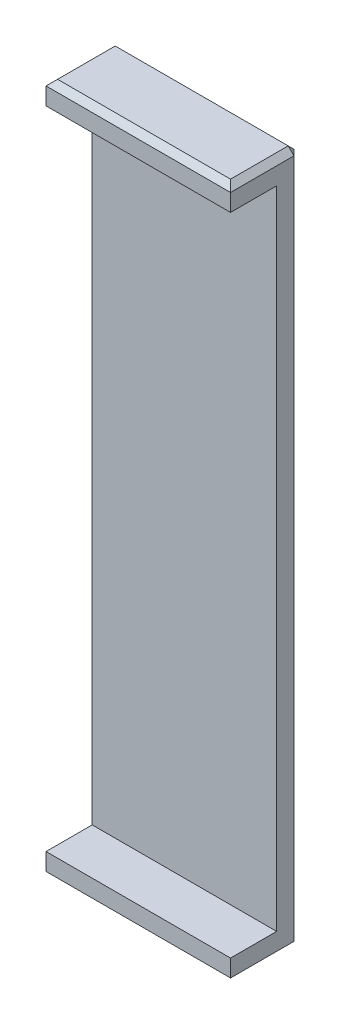
ISO-10303-21;
HEADER;
FILE_DESCRIPTION(('STEP AP214'),'2;1');
FILE_NAME('part.step','',(''),(''),'','','');
FILE_SCHEMA(('AUTOMOTIVE_DESIGN { 1 0 10303 214 1 1 1 1 }'));
ENDSEC;
DATA;
#1=APPLICATION_CONTEXT('core data for automotive mechanical design processes');
#2=APPLICATION_PROTOCOL_DEFINITION('international standard','automotive_design',2000,#1);
#3=PRODUCT_CONTEXT('',#1,'mechanical');
#4=PRODUCT('Part','Part','',(#3));
#5=PRODUCT_RELATED_PRODUCT_CATEGORY('part','',(#4));
#6=PRODUCT_DEFINITION_FORMATION('','',#4);
#7=PRODUCT_DEFINITION_CONTEXT('part definition',#1,'design');
#8=PRODUCT_DEFINITION('design','',#6,#7);
#9=PRODUCT_DEFINITION_SHAPE('','',#8);
#10=(LENGTH_UNIT() NAMED_UNIT(*) SI_UNIT(.MILLI.,.METRE.));
#11=(NAMED_UNIT(*) PLANE_ANGLE_UNIT() SI_UNIT($,.RADIAN.));
#12=(NAMED_UNIT(*) SI_UNIT($,.STERADIAN.) SOLID_ANGLE_UNIT());
#13=UNCERTAINTY_MEASURE_WITH_UNIT(LENGTH_MEASURE(1.E-05),#10,'distance_accuracy_value','');
#14=(GEOMETRIC_REPRESENTATION_CONTEXT(3) GLOBAL_UNCERTAINTY_ASSIGNED_CONTEXT((#13)) GLOBAL_UNIT_ASSIGNED_CONTEXT((#10,
#11,#12)) REPRESENTATION_CONTEXT('',''));
#15=CARTESIAN_POINT('',(0.,0.,0.));
#16=DIRECTION('',(0.,0.,1.));
#17=DIRECTION('',(1.,0.,0.));
#18=AXIS2_PLACEMENT_3D('',#15,#16,#17);
#19=CARTESIAN_POINT('',(0.,0.,0.));
#20=DIRECTION('',(0.,0.,1.));
#21=DIRECTION('',(1.,0.,0.));
#22=AXIS2_PLACEMENT_3D('',#19,#20,#21);
#23=PLANE('',#22);
#24=DIRECTION('',(0.,1.,0.));
#25=VECTOR('',#24,1.);
#26=CARTESIAN_POINT('',(118.435797513272,159.285783833506,0.));
#27=LINE('',#26,#25);
#28=CARTESIAN_POINT('',(118.435797513272,-130.714216166494,0.));
#29=VERTEX_POINT('',#28);
#30=CARTESIAN_POINT('',(118.435797513272,149.285783833506,0.));
#31=VERTEX_POINT('',#30);
#32=EDGE_CURVE('E184',#29,#31,#27,.T.);
#33=ORIENTED_EDGE('',*,*,#32,.T.);
#34=DIRECTION('',(1.,0.,0.));
#35=VECTOR('',#34,1.);
#36=CARTESIAN_POINT('',(38.4357975132722,149.285783833506,0.));
#37=LINE('',#36,#35);
#38=CARTESIAN_POINT('',(38.4357975132722,149.285783833506,0.));
#39=VERTEX_POINT('',#38);
#40=EDGE_CURVE('E148',#39,#31,#37,.T.);
#41=ORIENTED_EDGE('',*,*,#40,.F.);
#42=DIRECTION('',(0.,-1.,0.));
#43=VECTOR('',#42,1.);
#44=CARTESIAN_POINT('',(38.4357975132722,159.285783833506,0.));
#45=LINE('',#44,#43);
#46=CARTESIAN_POINT('',(38.4357975132722,-130.714216166494,0.));
#47=VERTEX_POINT('',#46);
#48=EDGE_CURVE('E163',#39,#47,#45,.T.);
#49=ORIENTED_EDGE('',*,*,#48,.T.);
#50=DIRECTION('',(-1.,0.,0.));
#51=VECTOR('',#50,1.);
#52=CARTESIAN_POINT('',(38.4357975132722,-130.714216166494,0.));
#53=LINE('',#52,#51);
#54=EDGE_CURVE('E164',#29,#47,#53,.T.);
#55=ORIENTED_EDGE('',*,*,#54,.F.);
#56=EDGE_LOOP('',(#33,#41,#49,#55));
#57=FACE_BOUND('',#56,.T.);
#58=ADVANCED_FACE('F33',(#57),#23,.T.);
#59=CARTESIAN_POINT('',(38.4357975132722,159.285783833506,-10.));
#60=DIRECTION('',(-1.,0.,0.));
#61=DIRECTION('',(0.,-1.,0.));
#62=AXIS2_PLACEMENT_3D('',#59,#60,#61);
#63=PLANE('',#62);
#64=DIRECTION('',(0.,-1.,0.));
#65=VECTOR('',#64,1.);
#66=CARTESIAN_POINT('',(38.4357975132722,159.285783833506,20.));
#67=LINE('',#66,#65);
#68=CARTESIAN_POINT('',(38.4357975132722,156.785783833506,20.));
#69=VERTEX_POINT('',#68);
#70=CARTESIAN_POINT('',(38.4357975132722,149.285783833506,20.));
#71=VERTEX_POINT('',#70);
#72=EDGE_CURVE('E137',#69,#71,#67,.T.);
#73=ORIENTED_EDGE('',*,*,#72,.F.);
#74=DIRECTION('',(0.,0.,-1.));
#75=VECTOR('',#74,1.);
#76=CARTESIAN_POINT('',(38.4357975132722,156.785783833506,-10.));
#77=LINE('',#76,#75);
#78=CARTESIAN_POINT('',(38.4357975132722,156.785783833506,-7.49999999999994));
#79=VERTEX_POINT('',#78);
#80=EDGE_CURVE('E216',#69,#79,#77,.T.);
#81=ORIENTED_EDGE('',*,*,#80,.T.);
#82=DIRECTION('',(0.,-1.,0.));
#83=VECTOR('',#82,1.);
#84=CARTESIAN_POINT('',(38.4357975132722,-140.714216166494,-7.49999999999994));
#85=LINE('',#84,#83);
#86=CARTESIAN_POINT('',(38.4357975132722,-138.214216166494,-7.49999999999994));
#87=VERTEX_POINT('',#86);
#88=EDGE_CURVE('E212',#79,#87,#85,.T.);
#89=ORIENTED_EDGE('',*,*,#88,.T.);
#90=DIRECTION('',(0.,0.,1.));
#91=VECTOR('',#90,1.);
#92=CARTESIAN_POINT('',(38.4357975132722,-138.214216166494,-10.));
#93=LINE('',#92,#91);
#94=CARTESIAN_POINT('',(38.4357975132722,-138.214216166494,20.));
#95=VERTEX_POINT('',#94);
#96=EDGE_CURVE('E214',#87,#95,#93,.T.);
#97=ORIENTED_EDGE('',*,*,#96,.T.);
#98=DIRECTION('',(0.,-1.,0.));
#99=VECTOR('',#98,1.);
#100=CARTESIAN_POINT('',(38.4357975132722,-140.714216166494,20.));
#101=LINE('',#100,#99);
#102=CARTESIAN_POINT('',(38.4357975132722,-130.714216166494,20.));
#103=VERTEX_POINT('',#102);
#104=EDGE_CURVE('E167',#103,#95,#101,.T.);
#105=ORIENTED_EDGE('',*,*,#104,.F.);
#106=DIRECTION('',(0.,0.,-1.));
#107=VECTOR('',#106,1.);
#108=CARTESIAN_POINT('',(38.4357975132722,-130.714216166494,20.));
#109=LINE('',#108,#107);
#110=EDGE_CURVE('E177',#103,#47,#109,.T.);
#111=ORIENTED_EDGE('',*,*,#110,.T.);
#112=ORIENTED_EDGE('',*,*,#48,.F.);
#113=DIRECTION('',(0.,0.,-1.));
#114=VECTOR('',#113,1.);
#115=CARTESIAN_POINT('',(38.4357975132722,149.285783833506,20.));
#116=LINE('',#115,#114);
#117=EDGE_CURVE('E154',#71,#39,#116,.T.);
#118=ORIENTED_EDGE('',*,*,#117,.F.);
#119=EDGE_LOOP('',(#73,#81,#89,#97,#105,#111,#112,#118));
#120=FACE_BOUND('',#119,.T.);
#121=ADVANCED_FACE('F161',(#120),#63,.T.);
#122=CARTESIAN_POINT('',(38.4357975132722,159.285783833506,-10.));
#123=DIRECTION('',(0.,1.,0.));
#124=DIRECTION('',(0.,0.,1.));
#125=AXIS2_PLACEMENT_3D('',#122,#123,#124);
#126=PLANE('',#125);
#127=DIRECTION('',(0.,0.,-1.));
#128=VECTOR('',#127,1.);
#129=CARTESIAN_POINT('',(115.935797513272,159.285783833506,-10.));
#130=LINE('',#129,#128);
#131=CARTESIAN_POINT('',(115.935797513272,159.285783833506,17.4999999999999));
#132=VERTEX_POINT('',#131);
#133=CARTESIAN_POINT('',(115.935797513272,159.285783833506,-7.49999999999994));
#134=VERTEX_POINT('',#133);
#135=EDGE_CURVE('E190',#132,#134,#130,.T.);
#136=ORIENTED_EDGE('',*,*,#135,.T.);
#137=DIRECTION('',(-1.,0.,0.));
#138=VECTOR('',#137,1.);
#139=CARTESIAN_POINT('',(38.4357975132722,159.285783833506,-7.49999999999994));
#140=LINE('',#139,#138);
#141=CARTESIAN_POINT('',(40.9357975132722,159.285783833506,-7.49999999999994));
#142=VERTEX_POINT('',#141);
#143=EDGE_CURVE('E192',#134,#142,#140,.T.);
#144=ORIENTED_EDGE('',*,*,#143,.T.);
#145=DIRECTION('',(0.,0.,1.));
#146=VECTOR('',#145,1.);
#147=CARTESIAN_POINT('',(40.9357975132722,159.285783833506,-10.));
#148=LINE('',#147,#146);
#149=CARTESIAN_POINT('',(40.9357975132722,159.285783833506,17.4999999999999));
#150=VERTEX_POINT('',#149);
#151=EDGE_CURVE('E186',#142,#150,#148,.T.);
#152=ORIENTED_EDGE('',*,*,#151,.T.);
#153=DIRECTION('',(1.,0.,0.));
#154=VECTOR('',#153,1.);
#155=CARTESIAN_POINT('',(38.4357975132722,159.285783833506,17.4999999999999));
#156=LINE('',#155,#154);
#157=EDGE_CURVE('E188',#150,#132,#156,.T.);
#158=ORIENTED_EDGE('',*,*,#157,.T.);
#159=EDGE_LOOP('',(#136,#144,#152,#158));
#160=FACE_BOUND('',#159,.T.);
#161=ADVANCED_FACE('F293',(#160),#126,.T.);
#162=CARTESIAN_POINT('',(118.435797513272,159.285783833506,-10.));
#163=DIRECTION('',(1.,0.,0.));
#164=DIRECTION('',(0.,1.,0.));
#165=AXIS2_PLACEMENT_3D('',#162,#163,#164);
#166=PLANE('',#165);
#167=DIRECTION('',(0.,1.,0.));
#168=VECTOR('',#167,1.);
#169=CARTESIAN_POINT('',(118.435797513272,159.285783833506,-7.49999999999994));
#170=LINE('',#169,#168);
#171=CARTESIAN_POINT('',(118.435797513272,-138.214216166494,-7.49999999999994));
#172=VERTEX_POINT('',#171);
#173=CARTESIAN_POINT('',(118.435797513272,156.785783833506,-7.49999999999994));
#174=VERTEX_POINT('',#173);
#175=EDGE_CURVE('E206',#172,#174,#170,.T.);
#176=ORIENTED_EDGE('',*,*,#175,.T.);
#177=DIRECTION('',(0.,0.,1.));
#178=VECTOR('',#177,1.);
#179=CARTESIAN_POINT('',(118.435797513272,156.785783833506,-10.));
#180=LINE('',#179,#178);
#181=CARTESIAN_POINT('',(118.435797513272,156.785783833506,20.));
#182=VERTEX_POINT('',#181);
#183=EDGE_CURVE('E208',#174,#182,#180,.T.);
#184=ORIENTED_EDGE('',*,*,#183,.T.);
#185=DIRECTION('',(0.,1.,0.));
#186=VECTOR('',#185,1.);
#187=CARTESIAN_POINT('',(118.435797513272,159.285783833506,20.));
#188=LINE('',#187,#186);
#189=CARTESIAN_POINT('',(118.435797513272,149.285783833506,20.));
#190=VERTEX_POINT('',#189);
#191=EDGE_CURVE('E158',#190,#182,#188,.T.);
#192=ORIENTED_EDGE('',*,*,#191,.F.);
#193=DIRECTION('',(0.,0.,-1.));
#194=VECTOR('',#193,1.);
#195=CARTESIAN_POINT('',(118.435797513272,149.285783833506,20.));
#196=LINE('',#195,#194);
#197=EDGE_CURVE('E156',#190,#31,#196,.T.);
#198=ORIENTED_EDGE('',*,*,#197,.T.);
#199=ORIENTED_EDGE('',*,*,#32,.F.);
#200=DIRECTION('',(0.,0.,-1.));
#201=VECTOR('',#200,1.);
#202=CARTESIAN_POINT('',(118.435797513272,-130.714216166494,20.));
#203=LINE('',#202,#201);
#204=CARTESIAN_POINT('',(118.435797513272,-130.714216166494,20.));
#205=VERTEX_POINT('',#204);
#206=EDGE_CURVE('E180',#205,#29,#203,.T.);
#207=ORIENTED_EDGE('',*,*,#206,.F.);
#208=DIRECTION('',(0.,1.,0.));
#209=VECTOR('',#208,1.);
#210=CARTESIAN_POINT('',(118.435797513272,-140.714216166494,20.));
#211=LINE('',#210,#209);
#212=CARTESIAN_POINT('',(118.435797513272,-138.214216166494,20.));
#213=VERTEX_POINT('',#212);
#214=EDGE_CURVE('E174',#213,#205,#211,.T.);
#215=ORIENTED_EDGE('',*,*,#214,.F.);
#216=DIRECTION('',(0.,0.,-1.));
#217=VECTOR('',#216,1.);
#218=CARTESIAN_POINT('',(118.435797513272,-138.214216166494,-10.));
#219=LINE('',#218,#217);
#220=EDGE_CURVE('E204',#213,#172,#219,.T.);
#221=ORIENTED_EDGE('',*,*,#220,.T.);
#222=EDGE_LOOP('',(#176,#184,#192,#198,#199,#207,#215,#221));
#223=FACE_BOUND('',#222,.T.);
#224=ADVANCED_FACE('F271',(#223),#166,.T.);
#225=CARTESIAN_POINT('',(38.4357975132722,-140.714216166494,-10.));
#226=DIRECTION('',(0.,-1.,0.));
#227=DIRECTION('',(0.,0.,-1.));
#228=AXIS2_PLACEMENT_3D('',#225,#226,#227);
#229=PLANE('',#228);
#230=DIRECTION('',(0.,0.,-1.));
#231=VECTOR('',#230,1.);
#232=CARTESIAN_POINT('',(40.9357975132723,-140.714216166494,-10.));
#233=LINE('',#232,#231);
#234=CARTESIAN_POINT('',(40.9357975132723,-140.714216166494,17.4999999999999));
#235=VERTEX_POINT('',#234);
#236=CARTESIAN_POINT('',(40.9357975132723,-140.714216166494,-7.49999999999994));
#237=VERTEX_POINT('',#236);
#238=EDGE_CURVE('E218',#235,#237,#233,.T.);
#239=ORIENTED_EDGE('',*,*,#238,.T.);
#240=DIRECTION('',(1.,0.,0.));
#241=VECTOR('',#240,1.);
#242=CARTESIAN_POINT('',(118.435797513272,-140.714216166494,-7.49999999999994));
#243=LINE('',#242,#241);
#244=CARTESIAN_POINT('',(115.935797513272,-140.714216166494,-7.49999999999994));
#245=VERTEX_POINT('',#244);
#246=EDGE_CURVE('E42',#237,#245,#243,.T.);
#247=ORIENTED_EDGE('',*,*,#246,.T.);
#248=DIRECTION('',(0.,0.,1.));
#249=VECTOR('',#248,1.);
#250=CARTESIAN_POINT('',(115.935797513272,-140.714216166494,-10.));
#251=LINE('',#250,#249);
#252=CARTESIAN_POINT('',(115.935797513272,-140.714216166494,17.4999999999999));
#253=VERTEX_POINT('',#252);
#254=EDGE_CURVE('E58',#245,#253,#251,.T.);
#255=ORIENTED_EDGE('',*,*,#254,.T.);
#256=DIRECTION('',(-1.,0.,0.));
#257=VECTOR('',#256,1.);
#258=CARTESIAN_POINT('',(38.4357975132722,-140.714216166494,17.4999999999999));
#259=LINE('',#258,#257);
#260=EDGE_CURVE('E220',#253,#235,#259,.T.);
#261=ORIENTED_EDGE('',*,*,#260,.T.);
#262=EDGE_LOOP('',(#239,#247,#255,#261));
#263=FACE_BOUND('',#262,.T.);
#264=ADVANCED_FACE('F341',(#263),#229,.T.);
#265=CARTESIAN_POINT('',(0.,0.,-10.));
#266=DIRECTION('',(0.,0.,1.));
#267=DIRECTION('',(1.,0.,0.));
#268=AXIS2_PLACEMENT_3D('',#265,#266,#267);
#269=PLANE('',#268);
#270=DIRECTION('',(1.,0.,0.));
#271=VECTOR('',#270,1.);
#272=CARTESIAN_POINT('',(118.435797513272,156.785783833506,-10.));
#273=LINE('',#272,#271);
#274=CARTESIAN_POINT('',(40.9357975132722,156.785783833506,-10.));
#275=VERTEX_POINT('',#274);
#276=CARTESIAN_POINT('',(115.935797513272,156.785783833506,-10.));
#277=VERTEX_POINT('',#276);
#278=EDGE_CURVE('E199',#275,#277,#273,.T.);
#279=ORIENTED_EDGE('',*,*,#278,.T.);
#280=DIRECTION('',(0.,-1.,0.));
#281=VECTOR('',#280,1.);
#282=CARTESIAN_POINT('',(115.935797513272,-140.714216166494,-10.));
#283=LINE('',#282,#281);
#284=CARTESIAN_POINT('',(115.935797513272,-138.214216166494,-10.));
#285=VERTEX_POINT('',#284);
#286=EDGE_CURVE('E202',#277,#285,#283,.T.);
#287=ORIENTED_EDGE('',*,*,#286,.T.);
#288=DIRECTION('',(-1.,0.,0.));
#289=VECTOR('',#288,1.);
#290=CARTESIAN_POINT('',(38.4357975132722,-138.214216166494,-10.));
#291=LINE('',#290,#289);
#292=CARTESIAN_POINT('',(40.9357975132723,-138.214216166494,-10.));
#293=VERTEX_POINT('',#292);
#294=EDGE_CURVE('E197',#285,#293,#291,.T.);
#295=ORIENTED_EDGE('',*,*,#294,.T.);
#296=DIRECTION('',(0.,1.,0.));
#297=VECTOR('',#296,1.);
#298=CARTESIAN_POINT('',(40.9357975132722,159.285783833506,-10.));
#299=LINE('',#298,#297);
#300=EDGE_CURVE('E195',#293,#275,#299,.T.);
#301=ORIENTED_EDGE('',*,*,#300,.T.);
#302=EDGE_LOOP('',(#279,#287,#295,#301));
#303=FACE_BOUND('',#302,.T.);
#304=ADVANCED_FACE('F335',(#303),#269,.F.);
#305=CARTESIAN_POINT('',(38.4357975132722,-130.714216166494,20.));
#306=DIRECTION('',(0.,-1.,0.));
#307=DIRECTION('',(0.,0.,-1.));
#308=AXIS2_PLACEMENT_3D('',#305,#306,#307);
#309=PLANE('',#308);
#310=ORIENTED_EDGE('',*,*,#54,.T.);
#311=ORIENTED_EDGE('',*,*,#110,.F.);
#312=DIRECTION('',(-1.,0.,0.));
#313=VECTOR('',#312,1.);
#314=CARTESIAN_POINT('',(38.4357975132722,-130.714216166494,20.));
#315=LINE('',#314,#313);
#316=EDGE_CURVE('E176',#205,#103,#315,.T.);
#317=ORIENTED_EDGE('',*,*,#316,.F.);
#318=ORIENTED_EDGE('',*,*,#206,.T.);
#319=EDGE_LOOP('',(#310,#311,#317,#318));
#320=FACE_BOUND('',#319,.T.);
#321=ADVANCED_FACE('F324',(#320),#309,.F.);
#322=CARTESIAN_POINT('',(0.,0.,20.));
#323=DIRECTION('',(0.,0.,-1.));
#324=DIRECTION('',(-1.,0.,0.));
#325=AXIS2_PLACEMENT_3D('',#322,#323,#324);
#326=PLANE('',#325);
#327=ORIENTED_EDGE('',*,*,#104,.T.);
#328=DIRECTION('',(1.,0.,0.));
#329=VECTOR('',#328,1.);
#330=CARTESIAN_POINT('',(118.435797513272,-138.214216166494,20.));
#331=LINE('',#330,#329);
#332=EDGE_CURVE('E11',#95,#213,#331,.T.);
#333=ORIENTED_EDGE('',*,*,#332,.T.);
#334=ORIENTED_EDGE('',*,*,#214,.T.);
#335=ORIENTED_EDGE('',*,*,#316,.T.);
#336=EDGE_LOOP('',(#327,#333,#334,#335));
#337=FACE_BOUND('',#336,.T.);
#338=ADVANCED_FACE('F316',(#337),#326,.F.);
#339=CARTESIAN_POINT('',(38.4357975132722,149.285783833506,20.));
#340=DIRECTION('',(0.,1.,0.));
#341=DIRECTION('',(0.,0.,1.));
#342=AXIS2_PLACEMENT_3D('',#339,#340,#341);
#343=PLANE('',#342);
#344=ORIENTED_EDGE('',*,*,#40,.T.);
#345=ORIENTED_EDGE('',*,*,#197,.F.);
#346=DIRECTION('',(1.,0.,0.));
#347=VECTOR('',#346,1.);
#348=CARTESIAN_POINT('',(38.4357975132722,149.285783833506,20.));
#349=LINE('',#348,#347);
#350=EDGE_CURVE('E141',#71,#190,#349,.T.);
#351=ORIENTED_EDGE('',*,*,#350,.F.);
#352=ORIENTED_EDGE('',*,*,#117,.T.);
#353=EDGE_LOOP('',(#344,#345,#351,#352));
#354=FACE_BOUND('',#353,.T.);
#355=ADVANCED_FACE('F153',(#354),#343,.F.);
#356=CARTESIAN_POINT('',(0.,0.,20.));
#357=DIRECTION('',(0.,0.,1.));
#358=DIRECTION('',(1.,0.,0.));
#359=AXIS2_PLACEMENT_3D('',#356,#357,#358);
#360=PLANE('',#359);
#361=ORIENTED_EDGE('',*,*,#191,.T.);
#362=DIRECTION('',(-1.,0.,0.));
#363=VECTOR('',#362,1.);
#364=CARTESIAN_POINT('',(0.,156.785783833506,20.));
#365=LINE('',#364,#363);
#366=EDGE_CURVE('E144',#182,#69,#365,.T.);
#367=ORIENTED_EDGE('',*,*,#366,.T.);
#368=ORIENTED_EDGE('',*,*,#72,.T.);
#369=ORIENTED_EDGE('',*,*,#350,.T.);
#370=EDGE_LOOP('',(#361,#367,#368,#369));
#371=FACE_BOUND('',#370,.T.);
#372=ADVANCED_FACE('F140',(#371),#360,.T.);
#373=CARTESIAN_POINT('',(0.,-138.214216166494,20.));
#374=DIRECTION('',(0.,-0.707106781186548,0.707106781186547));
#375=DIRECTION('',(-1.,0.,0.));
#376=AXIS2_PLACEMENT_3D('',#373,#374,#375);
#377=PLANE('',#376);
#378=DIRECTION('',(0.577350269189621,-0.577350269189628,-0.577350269189628));
#379=VECTOR('',#378,1.);
#380=CARTESIAN_POINT('',(48.4357975132722,-148.214216166494,9.99999999999993));
#381=LINE('',#380,#379);
#382=EDGE_CURVE('E259',#235,#95,#381,.F.);
#383=ORIENTED_EDGE('',*,*,#382,.F.);
#384=ORIENTED_EDGE('',*,*,#260,.F.);
#385=DIRECTION('',(-0.577350269189623,-0.577350269189627,-0.577350269189627));
#386=VECTOR('',#385,1.);
#387=CARTESIAN_POINT('',(78.9571983421818,-177.692815337585,-19.4785991710907));
#388=LINE('',#387,#386);
#389=EDGE_CURVE('E37',#213,#253,#388,.T.);
#390=ORIENTED_EDGE('',*,*,#389,.F.);
#391=ORIENTED_EDGE('',*,*,#332,.F.);
#392=EDGE_LOOP('',(#383,#384,#390,#391));
#393=FACE_BOUND('',#392,.T.);
#394=ADVANCED_FACE('F35',(#393),#377,.T.);
#395=CARTESIAN_POINT('',(115.935797513272,-140.714216166494,-10.));
#396=DIRECTION('',(-0.707106781186549,0.707106781186545,0.));
#397=DIRECTION('',(0.,0.,1.));
#398=AXIS2_PLACEMENT_3D('',#395,#396,#397);
#399=PLANE('',#398);
#400=ORIENTED_EDGE('',*,*,#389,.T.);
#401=ORIENTED_EDGE('',*,*,#254,.F.);
#402=DIRECTION('',(0.707106781186545,0.707106781186549,0.));
#403=VECTOR('',#402,1.);
#404=CARTESIAN_POINT('',(115.935797513272,-140.714216166494,-7.49999999999994));
#405=LINE('',#404,#403);
#406=EDGE_CURVE('E50',#172,#245,#405,.F.);
#407=ORIENTED_EDGE('',*,*,#406,.F.);
#408=ORIENTED_EDGE('',*,*,#220,.F.);
#409=EDGE_LOOP('',(#400,#401,#407,#408));
#410=FACE_BOUND('',#409,.T.);
#411=ADVANCED_FACE('F321',(#410),#399,.F.);
#412=CARTESIAN_POINT('',(38.4357975132722,-138.214216166494,-10.));
#413=DIRECTION('',(0.707106781186552,0.707106781186544,0.));
#414=DIRECTION('',(0.,0.,1.));
#415=AXIS2_PLACEMENT_3D('',#412,#413,#414);
#416=PLANE('',#415);
#417=ORIENTED_EDGE('',*,*,#382,.T.);
#418=ORIENTED_EDGE('',*,*,#96,.F.);
#419=DIRECTION('',(0.707106781186544,-0.707106781186551,0.));
#420=VECTOR('',#419,1.);
#421=CARTESIAN_POINT('',(39.6857975132722,-139.464216166494,-7.49999999999994));
#422=LINE('',#421,#420);
#423=EDGE_CURVE('E254',#237,#87,#422,.F.);
#424=ORIENTED_EDGE('',*,*,#423,.F.);
#425=ORIENTED_EDGE('',*,*,#238,.F.);
#426=EDGE_LOOP('',(#417,#418,#424,#425));
#427=FACE_BOUND('',#426,.T.);
#428=ADVANCED_FACE('F312',(#427),#416,.F.);
#429=CARTESIAN_POINT('',(38.4357975132722,-140.714216166494,-7.49999999999994));
#430=DIRECTION('',(0.,-0.707106781186548,-0.707106781186548));
#431=DIRECTION('',(-1.,0.,0.));
#432=AXIS2_PLACEMENT_3D('',#429,#430,#431);
#433=PLANE('',#432);
#434=DIRECTION('',(0.,0.707106781186548,-0.707106781186548));
#435=VECTOR('',#434,1.);
#436=CARTESIAN_POINT('',(115.935797513272,-140.714216166494,-7.49999999999994));
#437=LINE('',#436,#435);
#438=EDGE_CURVE('E258',#245,#285,#437,.T.);
#439=ORIENTED_EDGE('',*,*,#438,.F.);
#440=ORIENTED_EDGE('',*,*,#246,.F.);
#441=DIRECTION('',(0.,-0.707106781186547,0.707106781186547));
#442=VECTOR('',#441,1.);
#443=CARTESIAN_POINT('',(40.9357975132723,-138.214216166494,-10.));
#444=LINE('',#443,#442);
#445=EDGE_CURVE('E251',#293,#237,#444,.T.);
#446=ORIENTED_EDGE('',*,*,#445,.F.);
#447=ORIENTED_EDGE('',*,*,#294,.F.);
#448=EDGE_LOOP('',(#439,#440,#446,#447));
#449=FACE_BOUND('',#448,.T.);
#450=ADVANCED_FACE('F367',(#449),#433,.T.);
#451=CARTESIAN_POINT('',(115.935797513272,-140.714216166494,-7.49999999999994));
#452=DIRECTION('',(0.577350269189629,-0.577350269189626,-0.577350269189623));
#453=DIRECTION('',(0.707106781186546,0.707106781186549,0.));
#454=AXIS2_PLACEMENT_3D('',#451,#452,#453);
#455=PLANE('',#454);
#456=ORIENTED_EDGE('',*,*,#406,.T.);
#457=ORIENTED_EDGE('',*,*,#438,.T.);
#458=DIRECTION('',(0.707106781186547,0.,0.707106781186548));
#459=VECTOR('',#458,1.);
#460=CARTESIAN_POINT('',(117.185797513272,-138.214216166494,-8.74999999999999));
#461=LINE('',#460,#459);
#462=EDGE_CURVE('E248',#172,#285,#461,.F.);
#463=ORIENTED_EDGE('',*,*,#462,.F.);
#464=EDGE_LOOP('',(#456,#457,#463));
#465=FACE_BOUND('',#464,.T.);
#466=ADVANCED_FACE('F364',(#465),#455,.T.);
#467=CARTESIAN_POINT('',(0.,156.785783833506,20.));
#468=DIRECTION('',(0.,-0.707106781186548,-0.707106781186547));
#469=DIRECTION('',(-1.,0.,0.));
#470=AXIS2_PLACEMENT_3D('',#467,#468,#469);
#471=PLANE('',#470);
#472=DIRECTION('',(0.577350269189626,0.577350269189626,-0.577350269189626));
#473=VECTOR('',#472,1.);
#474=CARTESIAN_POINT('',(50.1024641799389,168.452450500173,8.33333333333328));
#475=LINE('',#474,#473);
#476=EDGE_CURVE('E243',#69,#150,#475,.T.);
#477=ORIENTED_EDGE('',*,*,#476,.F.);
#478=ORIENTED_EDGE('',*,*,#366,.F.);
#479=DIRECTION('',(-0.577350269189626,0.577350269189626,-0.577350269189626));
#480=VECTOR('',#479,1.);
#481=CARTESIAN_POINT('',(78.9571983421815,196.264383004597,-19.4785991710908));
#482=LINE('',#481,#480);
#483=EDGE_CURVE('E246',#132,#182,#482,.F.);
#484=ORIENTED_EDGE('',*,*,#483,.F.);
#485=ORIENTED_EDGE('',*,*,#157,.F.);
#486=EDGE_LOOP('',(#477,#478,#484,#485));
#487=FACE_BOUND('',#486,.T.);
#488=ADVANCED_FACE('F297',(#487),#471,.F.);
#489=CARTESIAN_POINT('',(40.9357975132723,-138.214216166494,-10.));
#490=DIRECTION('',(-0.57735026918963,-0.577350269189624,-0.577350269189624));
#491=DIRECTION('',(-0.707106781186544,0.,0.707106781186551));
#492=AXIS2_PLACEMENT_3D('',#489,#490,#491);
#493=PLANE('',#492);
#494=ORIENTED_EDGE('',*,*,#445,.T.);
#495=ORIENTED_EDGE('',*,*,#423,.T.);
#496=DIRECTION('',(0.707106781186547,0.,-0.707106781186548));
#497=VECTOR('',#496,1.);
#498=CARTESIAN_POINT('',(40.9357975132723,-138.214216166494,-10.));
#499=LINE('',#498,#497);
#500=EDGE_CURVE('E240',#293,#87,#499,.F.);
#501=ORIENTED_EDGE('',*,*,#500,.F.);
#502=EDGE_LOOP('',(#494,#495,#501));
#503=FACE_BOUND('',#502,.T.);
#504=ADVANCED_FACE('F309',(#503),#493,.T.);
#505=CARTESIAN_POINT('',(118.435797513272,159.285783833506,-7.49999999999994));
#506=DIRECTION('',(0.707106781186549,0.,-0.707106781186547));
#507=DIRECTION('',(0.,-1.,0.));
#508=AXIS2_PLACEMENT_3D('',#505,#506,#507);
#509=PLANE('',#508);
#510=ORIENTED_EDGE('',*,*,#462,.T.);
#511=ORIENTED_EDGE('',*,*,#286,.F.);
#512=DIRECTION('',(-0.707106781186546,0.,-0.707106781186548));
#513=VECTOR('',#512,1.);
#514=CARTESIAN_POINT('',(115.935797513272,156.785783833506,-10.));
#515=LINE('',#514,#513);
#516=EDGE_CURVE('E237',#174,#277,#515,.T.);
#517=ORIENTED_EDGE('',*,*,#516,.F.);
#518=ORIENTED_EDGE('',*,*,#175,.F.);
#519=EDGE_LOOP('',(#510,#511,#517,#518));
#520=FACE_BOUND('',#519,.T.);
#521=ADVANCED_FACE('F284',(#520),#509,.T.);
#522=CARTESIAN_POINT('',(118.435797513272,156.785783833506,-10.));
#523=DIRECTION('',(-0.707106781186548,-0.707106781186548,0.));
#524=DIRECTION('',(0.,0.,1.));
#525=AXIS2_PLACEMENT_3D('',#522,#523,#524);
#526=PLANE('',#525);
#527=ORIENTED_EDGE('',*,*,#483,.T.);
#528=ORIENTED_EDGE('',*,*,#183,.F.);
#529=DIRECTION('',(-0.707106781186548,0.707106781186548,0.));
#530=VECTOR('',#529,1.);
#531=CARTESIAN_POINT('',(117.185797513272,158.035783833506,-7.49999999999994));
#532=LINE('',#531,#530);
#533=EDGE_CURVE('E234',#134,#174,#532,.F.);
#534=ORIENTED_EDGE('',*,*,#533,.F.);
#535=ORIENTED_EDGE('',*,*,#135,.F.);
#536=EDGE_LOOP('',(#527,#528,#534,#535));
#537=FACE_BOUND('',#536,.T.);
#538=ADVANCED_FACE('F278',(#537),#526,.F.);
#539=CARTESIAN_POINT('',(40.9357975132722,159.285783833506,-10.));
#540=DIRECTION('',(0.707106781186548,-0.707106781186548,0.));
#541=DIRECTION('',(0.,0.,1.));
#542=AXIS2_PLACEMENT_3D('',#539,#540,#541);
#543=PLANE('',#542);
#544=ORIENTED_EDGE('',*,*,#476,.T.);
#545=ORIENTED_EDGE('',*,*,#151,.F.);
#546=DIRECTION('',(-0.707106781186548,-0.707106781186548,0.));
#547=VECTOR('',#546,1.);
#548=CARTESIAN_POINT('',(40.9357975132722,159.285783833506,-7.49999999999994));
#549=LINE('',#548,#547);
#550=EDGE_CURVE('E231',#79,#142,#549,.F.);
#551=ORIENTED_EDGE('',*,*,#550,.F.);
#552=ORIENTED_EDGE('',*,*,#80,.F.);
#553=EDGE_LOOP('',(#544,#545,#551,#552));
#554=FACE_BOUND('',#553,.T.);
#555=ADVANCED_FACE('F301',(#554),#543,.F.);
#556=CARTESIAN_POINT('',(38.4357975132722,159.285783833506,-7.49999999999994));
#557=DIRECTION('',(-0.707106781186548,0.,-0.707106781186547));
#558=DIRECTION('',(0.,1.,0.));
#559=AXIS2_PLACEMENT_3D('',#556,#557,#558);
#560=PLANE('',#559);
#561=ORIENTED_EDGE('',*,*,#500,.T.);
#562=ORIENTED_EDGE('',*,*,#88,.F.);
#563=DIRECTION('',(-0.707106781186547,0.,0.707106781186548));
#564=VECTOR('',#563,1.);
#565=CARTESIAN_POINT('',(39.6857975132722,156.785783833506,-8.74999999999997));
#566=LINE('',#565,#564);
#567=EDGE_CURVE('E228',#275,#79,#566,.T.);
#568=ORIENTED_EDGE('',*,*,#567,.F.);
#569=ORIENTED_EDGE('',*,*,#300,.F.);
#570=EDGE_LOOP('',(#561,#562,#568,#569));
#571=FACE_BOUND('',#570,.T.);
#572=ADVANCED_FACE('F305',(#571),#560,.T.);
#573=CARTESIAN_POINT('',(115.935797513272,156.785783833506,-10.));
#574=DIRECTION('',(0.577350269189626,0.577350269189626,-0.577350269189626));
#575=DIRECTION('',(-0.707106781186547,0.,-0.707106781186547));
#576=AXIS2_PLACEMENT_3D('',#573,#574,#575);
#577=PLANE('',#576);
#578=ORIENTED_EDGE('',*,*,#533,.T.);
#579=ORIENTED_EDGE('',*,*,#516,.T.);
#580=DIRECTION('',(0.,0.707106781186548,0.707106781186548));
#581=VECTOR('',#580,1.);
#582=CARTESIAN_POINT('',(115.935797513272,156.785783833506,-10.));
#583=LINE('',#582,#581);
#584=EDGE_CURVE('E226',#134,#277,#583,.F.);
#585=ORIENTED_EDGE('',*,*,#584,.F.);
#586=EDGE_LOOP('',(#578,#579,#585));
#587=FACE_BOUND('',#586,.T.);
#588=ADVANCED_FACE('F286',(#587),#577,.T.);
#589=CARTESIAN_POINT('',(40.9357975132722,159.285783833506,-7.49999999999994));
#590=DIRECTION('',(-0.577350269189626,0.577350269189626,-0.577350269189626));
#591=DIRECTION('',(-0.707106781186547,0.,0.707106781186547));
#592=AXIS2_PLACEMENT_3D('',#589,#590,#591);
#593=PLANE('',#592);
#594=ORIENTED_EDGE('',*,*,#567,.T.);
#595=ORIENTED_EDGE('',*,*,#550,.T.);
#596=DIRECTION('',(0.,-0.707106781186548,-0.707106781186548));
#597=VECTOR('',#596,1.);
#598=CARTESIAN_POINT('',(40.9357975132722,159.285783833506,-7.49999999999994));
#599=LINE('',#598,#597);
#600=EDGE_CURVE('E224',#275,#142,#599,.F.);
#601=ORIENTED_EDGE('',*,*,#600,.F.);
#602=EDGE_LOOP('',(#594,#595,#601));
#603=FACE_BOUND('',#602,.T.);
#604=ADVANCED_FACE('F346',(#603),#593,.T.);
#605=CARTESIAN_POINT('',(38.4357975132722,159.285783833506,-7.49999999999994));
#606=DIRECTION('',(0.,0.707106781186548,-0.707106781186548));
#607=DIRECTION('',(1.,0.,0.));
#608=AXIS2_PLACEMENT_3D('',#605,#606,#607);
#609=PLANE('',#608);
#610=ORIENTED_EDGE('',*,*,#584,.T.);
#611=ORIENTED_EDGE('',*,*,#278,.F.);
#612=ORIENTED_EDGE('',*,*,#600,.T.);
#613=ORIENTED_EDGE('',*,*,#143,.F.);
#614=EDGE_LOOP('',(#610,#611,#612,#613));
#615=FACE_BOUND('',#614,.T.);
#616=ADVANCED_FACE('F290',(#615),#609,.T.);
#617=CLOSED_SHELL('',(#58,#121,#161,#224,#264,#304,#321,#338,#355,#372,#394,#411,#428,#450,#466,
#488,#504,#521,#538,#555,#572,#588,#604,#616));
#618=MANIFOLD_SOLID_BREP('B2',#617);
#619=ADVANCED_BREP_SHAPE_REPRESENTATION('',(#18,#618),#14);
#620=SHAPE_DEFINITION_REPRESENTATION(#9,#619);
ENDSEC;
END-ISO-10303-21;
